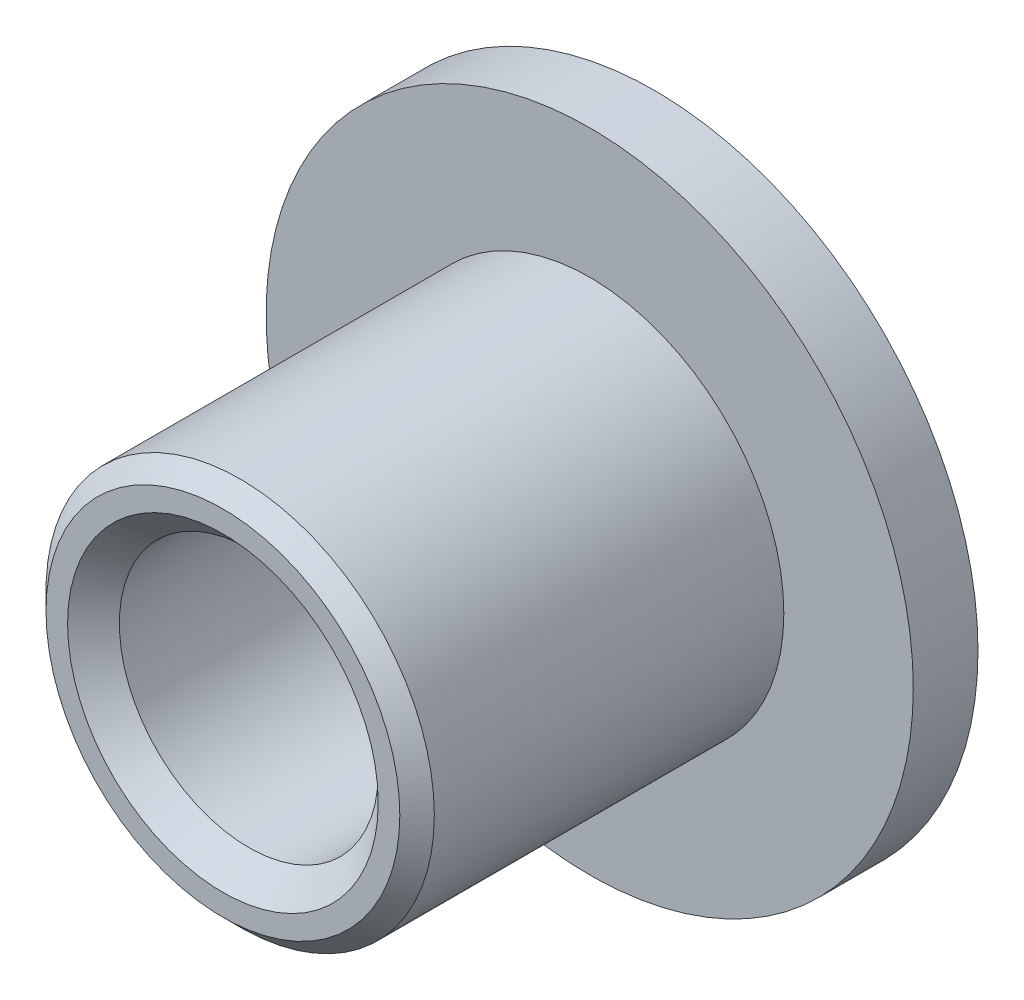
ISO-10303-21;
HEADER;
FILE_DESCRIPTION(('STEP AP214'),'2;1');
FILE_NAME('part.step','',(''),(''),'','','');
FILE_SCHEMA(('AUTOMOTIVE_DESIGN { 1 0 10303 214 1 1 1 1 }'));
ENDSEC;
DATA;
#1=APPLICATION_CONTEXT('core data for automotive mechanical design processes');
#2=APPLICATION_PROTOCOL_DEFINITION('international standard','automotive_design',2000,#1);
#3=PRODUCT_CONTEXT('',#1,'mechanical');
#4=PRODUCT('Part','Part','',(#3));
#5=PRODUCT_RELATED_PRODUCT_CATEGORY('part','',(#4));
#6=PRODUCT_DEFINITION_FORMATION('','',#4);
#7=PRODUCT_DEFINITION_CONTEXT('part definition',#1,'design');
#8=PRODUCT_DEFINITION('design','',#6,#7);
#9=PRODUCT_DEFINITION_SHAPE('','',#8);
#10=(LENGTH_UNIT() NAMED_UNIT(*) SI_UNIT(.MILLI.,.METRE.));
#11=(NAMED_UNIT(*) PLANE_ANGLE_UNIT() SI_UNIT($,.RADIAN.));
#12=(NAMED_UNIT(*) SI_UNIT($,.STERADIAN.) SOLID_ANGLE_UNIT());
#13=UNCERTAINTY_MEASURE_WITH_UNIT(LENGTH_MEASURE(1.E-05),#10,'distance_accuracy_value','');
#14=(GEOMETRIC_REPRESENTATION_CONTEXT(3) GLOBAL_UNCERTAINTY_ASSIGNED_CONTEXT((#13)) GLOBAL_UNIT_ASSIGNED_CONTEXT((#10,
#11,#12)) REPRESENTATION_CONTEXT('',''));
#15=CARTESIAN_POINT('',(0.,0.,0.));
#16=DIRECTION('',(0.,0.,1.));
#17=DIRECTION('',(1.,0.,0.));
#18=AXIS2_PLACEMENT_3D('',#15,#16,#17);
#19=CARTESIAN_POINT('',(0.,0.,0.3));
#20=DIRECTION('',(0.,0.,-1.));
#21=DIRECTION('',(1.,0.,0.));
#22=AXIS2_PLACEMENT_3D('',#19,#20,#21);
#23=CONICAL_SURFACE('',#22,1.5,0.785398163397);
#24=CARTESIAN_POINT('',(0.,0.,0.3));
#25=DIRECTION('',(0.,0.,1.));
#26=DIRECTION('',(1.,0.,0.));
#27=AXIS2_PLACEMENT_3D('',#24,#25,#26);
#28=CIRCLE('',#27,1.5);
#29=CARTESIAN_POINT('',(1.5,0.,0.3));
#30=VERTEX_POINT('',#29);
#31=EDGE_CURVE('E114',#30,#30,#28,.T.);
#32=ORIENTED_EDGE('',*,*,#31,.T.);
#33=DIRECTION('',(-0.707106781186548,0.,0.707106781186548));
#34=VECTOR('',#33,1.);
#35=CARTESIAN_POINT('',(1.5,0.,0.3));
#36=LINE('',#35,#34);
#37=CARTESIAN_POINT('',(1.8,0.,0.));
#38=VERTEX_POINT('',#37);
#39=EDGE_CURVE('E10',#38,#30,#36,.T.);
#40=ORIENTED_EDGE('',*,*,#39,.F.);
#41=CARTESIAN_POINT('',(0.,0.,0.));
#42=DIRECTION('',(0.,0.,1.));
#43=DIRECTION('',(1.,0.,0.));
#44=AXIS2_PLACEMENT_3D('',#41,#42,#43);
#45=CIRCLE('',#44,1.8);
#46=EDGE_CURVE('E109',#38,#38,#45,.T.);
#47=ORIENTED_EDGE('',*,*,#46,.F.);
#48=ORIENTED_EDGE('',*,*,#39,.T.);
#49=EDGE_LOOP('',(#32,#40,#47,#48));
#50=FACE_BOUND('',#49,.T.);
#51=ADVANCED_FACE('F16',(#50),#23,.F.);
#52=CARTESIAN_POINT('',(0.,0.,0.));
#53=DIRECTION('',(0.,0.,1.));
#54=DIRECTION('',(1.,0.,0.));
#55=AXIS2_PLACEMENT_3D('',#52,#53,#54);
#56=CYLINDRICAL_SURFACE('',#55,1.5);
#57=ORIENTED_EDGE('',*,*,#31,.F.);
#58=DIRECTION('',(0.,0.,1.));
#59=VECTOR('',#58,1.);
#60=CARTESIAN_POINT('',(1.5,0.,0.));
#61=LINE('',#60,#59);
#62=CARTESIAN_POINT('',(1.5,0.,4.7));
#63=VERTEX_POINT('',#62);
#64=EDGE_CURVE('E19',#30,#63,#61,.T.);
#65=ORIENTED_EDGE('',*,*,#64,.T.);
#66=CARTESIAN_POINT('',(0.,0.,4.7));
#67=DIRECTION('',(0.,0.,1.));
#68=DIRECTION('',(1.,0.,0.));
#69=AXIS2_PLACEMENT_3D('',#66,#67,#68);
#70=CIRCLE('',#69,1.5);
#71=EDGE_CURVE('E105',#63,#63,#70,.T.);
#72=ORIENTED_EDGE('',*,*,#71,.T.);
#73=ORIENTED_EDGE('',*,*,#64,.F.);
#74=EDGE_LOOP('',(#57,#65,#72,#73));
#75=FACE_BOUND('',#74,.T.);
#76=ADVANCED_FACE('F130',(#75),#56,.F.);
#77=CARTESIAN_POINT('',(0.,0.,0.));
#78=DIRECTION('',(0.,0.,1.));
#79=DIRECTION('',(1.,0.,0.));
#80=AXIS2_PLACEMENT_3D('',#77,#78,#79);
#81=PLANE('',#80);
#82=CARTESIAN_POINT('',(0.,0.,0.));
#83=DIRECTION('',(0.,0.,1.));
#84=DIRECTION('',(1.,0.,0.));
#85=AXIS2_PLACEMENT_3D('',#82,#83,#84);
#86=CIRCLE('',#85,3.75);
#87=CARTESIAN_POINT('',(3.75,0.,0.));
#88=VERTEX_POINT('',#87);
#89=EDGE_CURVE('E97',#88,#88,#86,.T.);
#90=ORIENTED_EDGE('',*,*,#89,.F.);
#91=EDGE_LOOP('',(#90));
#92=FACE_BOUND('',#91,.T.);
#93=ORIENTED_EDGE('',*,*,#46,.T.);
#94=EDGE_LOOP('',(#93));
#95=FACE_BOUND('',#94,.T.);
#96=ADVANCED_FACE('F128',(#92,#95),#81,.F.);
#97=CARTESIAN_POINT('',(0.,0.,4.7));
#98=DIRECTION('',(0.,0.,1.));
#99=DIRECTION('',(1.,0.,0.));
#100=AXIS2_PLACEMENT_3D('',#97,#98,#99);
#101=CONICAL_SURFACE('',#100,1.5,0.785398163397);
#102=CARTESIAN_POINT('',(0.,0.,5.));
#103=DIRECTION('',(0.,0.,1.));
#104=DIRECTION('',(1.,0.,0.));
#105=AXIS2_PLACEMENT_3D('',#102,#103,#104);
#106=CIRCLE('',#105,1.8);
#107=CARTESIAN_POINT('',(1.8,0.,5.));
#108=VERTEX_POINT('',#107);
#109=EDGE_CURVE('E98',#108,#108,#106,.T.);
#110=ORIENTED_EDGE('',*,*,#109,.T.);
#111=DIRECTION('',(0.707106781186548,0.,0.707106781186548));
#112=VECTOR('',#111,1.);
#113=CARTESIAN_POINT('',(1.5,0.,4.7));
#114=LINE('',#113,#112);
#115=EDGE_CURVE('E110',#63,#108,#114,.T.);
#116=ORIENTED_EDGE('',*,*,#115,.F.);
#117=ORIENTED_EDGE('',*,*,#71,.F.);
#118=ORIENTED_EDGE('',*,*,#115,.T.);
#119=EDGE_LOOP('',(#110,#116,#117,#118));
#120=FACE_BOUND('',#119,.T.);
#121=ADVANCED_FACE('F140',(#120),#101,.F.);
#122=CARTESIAN_POINT('',(0.,0.,0.));
#123=DIRECTION('',(0.,0.,1.));
#124=DIRECTION('',(1.,0.,0.));
#125=AXIS2_PLACEMENT_3D('',#122,#123,#124);
#126=CYLINDRICAL_SURFACE('',#125,3.75);
#127=CARTESIAN_POINT('',(0.,0.,0.75));
#128=DIRECTION('',(0.,0.,1.));
#129=DIRECTION('',(1.,0.,0.));
#130=AXIS2_PLACEMENT_3D('',#127,#128,#129);
#131=CIRCLE('',#130,3.75);
#132=CARTESIAN_POINT('',(3.75,0.,0.75));
#133=VERTEX_POINT('',#132);
#134=EDGE_CURVE('E94',#133,#133,#131,.T.);
#135=ORIENTED_EDGE('',*,*,#134,.F.);
#136=DIRECTION('',(0.,0.,1.));
#137=VECTOR('',#136,1.);
#138=CARTESIAN_POINT('',(3.75,0.,0.));
#139=LINE('',#138,#137);
#140=EDGE_CURVE('E96',#88,#133,#139,.T.);
#141=ORIENTED_EDGE('',*,*,#140,.F.);
#142=ORIENTED_EDGE('',*,*,#89,.T.);
#143=ORIENTED_EDGE('',*,*,#140,.T.);
#144=EDGE_LOOP('',(#135,#141,#142,#143));
#145=FACE_BOUND('',#144,.T.);
#146=ADVANCED_FACE('F146',(#145),#126,.T.);
#147=CARTESIAN_POINT('',(0.,0.,5.));
#148=DIRECTION('',(0.,0.,1.));
#149=DIRECTION('',(1.,0.,0.));
#150=AXIS2_PLACEMENT_3D('',#147,#148,#149);
#151=PLANE('',#150);
#152=ORIENTED_EDGE('',*,*,#109,.F.);
#153=EDGE_LOOP('',(#152));
#154=FACE_BOUND('',#153,.T.);
#155=CARTESIAN_POINT('',(0.,0.,5.));
#156=DIRECTION('',(0.,0.,1.));
#157=DIRECTION('',(1.,0.,0.));
#158=AXIS2_PLACEMENT_3D('',#155,#156,#157);
#159=CIRCLE('',#158,2.05);
#160=CARTESIAN_POINT('',(2.05,0.,5.));
#161=VERTEX_POINT('',#160);
#162=EDGE_CURVE('E87',#161,#161,#159,.T.);
#163=ORIENTED_EDGE('',*,*,#162,.T.);
#164=EDGE_LOOP('',(#163));
#165=FACE_BOUND('',#164,.T.);
#166=ADVANCED_FACE('F145',(#154,#165),#151,.T.);
#167=CARTESIAN_POINT('',(0.,0.,0.75));
#168=DIRECTION('',(0.,0.,1.));
#169=DIRECTION('',(1.,0.,0.));
#170=AXIS2_PLACEMENT_3D('',#167,#168,#169);
#171=PLANE('',#170);
#172=CARTESIAN_POINT('',(0.,0.,0.75));
#173=DIRECTION('',(0.,0.,1.));
#174=DIRECTION('',(1.,0.,0.));
#175=AXIS2_PLACEMENT_3D('',#172,#173,#174);
#176=CIRCLE('',#175,2.25);
#177=CARTESIAN_POINT('',(2.25,0.,0.75));
#178=VERTEX_POINT('',#177);
#179=EDGE_CURVE('E73',#178,#178,#176,.T.);
#180=ORIENTED_EDGE('',*,*,#179,.F.);
#181=EDGE_LOOP('',(#180));
#182=FACE_BOUND('',#181,.T.);
#183=ORIENTED_EDGE('',*,*,#134,.T.);
#184=EDGE_LOOP('',(#183));
#185=FACE_BOUND('',#184,.T.);
#186=ADVANCED_FACE('F159',(#182,#185),#171,.T.);
#187=CARTESIAN_POINT('',(0.,0.,4.8));
#188=DIRECTION('',(0.,0.,-1.));
#189=DIRECTION('',(1.,0.,0.));
#190=AXIS2_PLACEMENT_3D('',#187,#188,#189);
#191=CONICAL_SURFACE('',#190,2.25,0.785398163397);
#192=DIRECTION('',(-0.707106781186548,0.,0.707106781186548));
#193=VECTOR('',#192,1.);
#194=CARTESIAN_POINT('',(2.25,0.,4.8));
#195=LINE('',#194,#193);
#196=CARTESIAN_POINT('',(2.25,0.,4.8));
#197=VERTEX_POINT('',#196);
#198=EDGE_CURVE('E79',#197,#161,#195,.T.);
#199=ORIENTED_EDGE('',*,*,#198,.F.);
#200=CARTESIAN_POINT('',(0.,0.,4.8));
#201=DIRECTION('',(0.,0.,1.));
#202=DIRECTION('',(1.,0.,0.));
#203=AXIS2_PLACEMENT_3D('',#200,#201,#202);
#204=CIRCLE('',#203,2.25);
#205=EDGE_CURVE('E80',#197,#197,#204,.T.);
#206=ORIENTED_EDGE('',*,*,#205,.T.);
#207=ORIENTED_EDGE('',*,*,#198,.T.);
#208=ORIENTED_EDGE('',*,*,#162,.F.);
#209=EDGE_LOOP('',(#199,#206,#207,#208));
#210=FACE_BOUND('',#209,.T.);
#211=ADVANCED_FACE('F162',(#210),#191,.T.);
#212=CARTESIAN_POINT('',(0.,0.,0.));
#213=DIRECTION('',(0.,0.,1.));
#214=DIRECTION('',(1.,0.,0.));
#215=AXIS2_PLACEMENT_3D('',#212,#213,#214);
#216=CYLINDRICAL_SURFACE('',#215,2.25);
#217=DIRECTION('',(0.,0.,1.));
#218=VECTOR('',#217,1.);
#219=CARTESIAN_POINT('',(2.25,0.,0.));
#220=LINE('',#219,#218);
#221=EDGE_CURVE('E76',#178,#197,#220,.T.);
#222=ORIENTED_EDGE('',*,*,#221,.T.);
#223=ORIENTED_EDGE('',*,*,#205,.F.);
#224=ORIENTED_EDGE('',*,*,#221,.F.);
#225=ORIENTED_EDGE('',*,*,#179,.T.);
#226=EDGE_LOOP('',(#222,#223,#224,#225));
#227=FACE_BOUND('',#226,.T.);
#228=ADVANCED_FACE('F74',(#227),#216,.T.);
#229=CLOSED_SHELL('',(#51,#76,#96,#121,#146,#166,#186,#211,#228));
#230=MANIFOLD_SOLID_BREP('B1',#229);
#231=ADVANCED_BREP_SHAPE_REPRESENTATION('',(#18,#230),#14);
#232=SHAPE_DEFINITION_REPRESENTATION(#9,#231);
ENDSEC;
END-ISO-10303-21;
